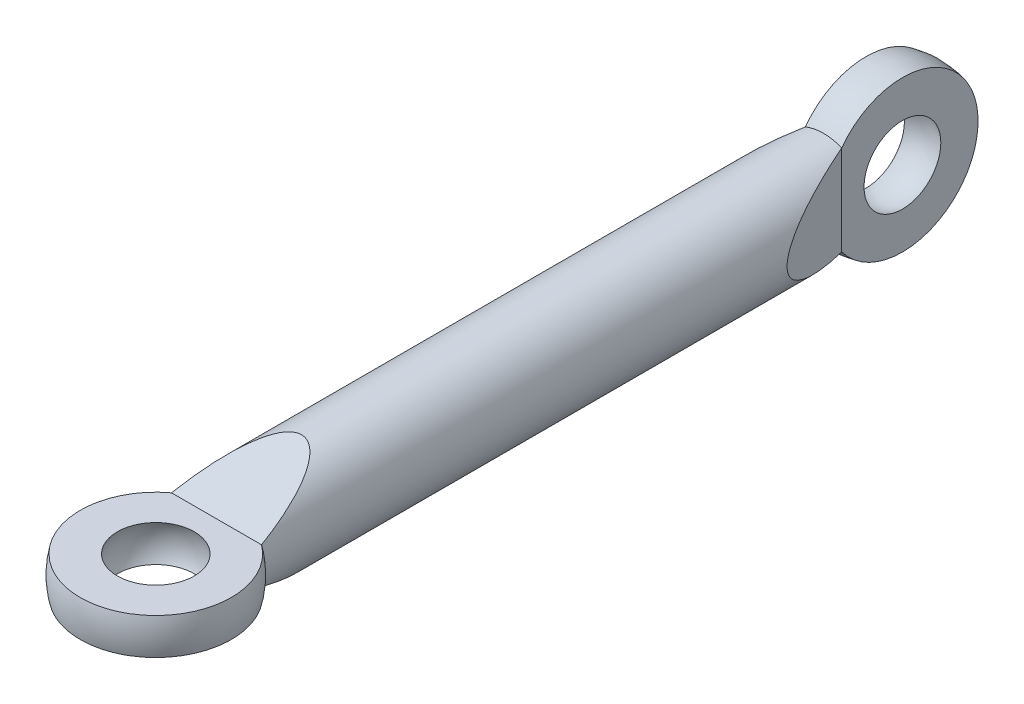
ISO-10303-21;
HEADER;
FILE_DESCRIPTION(('STEP AP214'),'2;1');
FILE_NAME('part.step','',(''),(''),'','','');
FILE_SCHEMA(('AUTOMOTIVE_DESIGN { 1 0 10303 214 1 1 1 1 }'));
ENDSEC;
DATA;
#1=APPLICATION_CONTEXT('core data for automotive mechanical design processes');
#2=APPLICATION_PROTOCOL_DEFINITION('international standard','automotive_design',2000,#1);
#3=PRODUCT_CONTEXT('',#1,'mechanical');
#4=PRODUCT('Part','Part','',(#3));
#5=PRODUCT_RELATED_PRODUCT_CATEGORY('part','',(#4));
#6=PRODUCT_DEFINITION_FORMATION('','',#4);
#7=PRODUCT_DEFINITION_CONTEXT('part definition',#1,'design');
#8=PRODUCT_DEFINITION('design','',#6,#7);
#9=PRODUCT_DEFINITION_SHAPE('','',#8);
#10=(LENGTH_UNIT() NAMED_UNIT(*) SI_UNIT(.MILLI.,.METRE.));
#11=(NAMED_UNIT(*) PLANE_ANGLE_UNIT() SI_UNIT($,.RADIAN.));
#12=(NAMED_UNIT(*) SI_UNIT($,.STERADIAN.) SOLID_ANGLE_UNIT());
#13=UNCERTAINTY_MEASURE_WITH_UNIT(LENGTH_MEASURE(1.E-05),#10,'distance_accuracy_value','');
#14=(GEOMETRIC_REPRESENTATION_CONTEXT(3) GLOBAL_UNCERTAINTY_ASSIGNED_CONTEXT((#13)) GLOBAL_UNIT_ASSIGNED_CONTEXT((#10,
#11,#12)) REPRESENTATION_CONTEXT('',''));
#15=CARTESIAN_POINT('',(0.,0.,0.));
#16=DIRECTION('',(0.,0.,1.));
#17=DIRECTION('',(1.,0.,0.));
#18=AXIS2_PLACEMENT_3D('',#15,#16,#17);
#19=CARTESIAN_POINT('',(0.,0.,25.));
#20=DIRECTION('',(0.,0.,-1.));
#21=DIRECTION('',(-1.,0.,0.));
#22=AXIS2_PLACEMENT_3D('',#19,#20,#21);
#23=CYLINDRICAL_SURFACE('',#22,4.);
#24=CARTESIAN_POINT('',(0.,0.,-25.));
#25=DIRECTION('',(0.,0.,1.));
#26=DIRECTION('',(1.,0.,0.));
#27=AXIS2_PLACEMENT_3D('',#24,#25,#26);
#28=CIRCLE('',#27,4.);
#29=CARTESIAN_POINT('',(-1.5,3.70809924354783,-25.));
#30=VERTEX_POINT('',#29);
#31=CARTESIAN_POINT('',(1.5,3.70809924354784,-25.));
#32=VERTEX_POINT('',#31);
#33=EDGE_CURVE('E85',#30,#32,#28,.F.);
#34=ORIENTED_EDGE('',*,*,#33,.F.);
#35=CARTESIAN_POINT('',(0.,0.,-29.2));
#36=DIRECTION('',(0.941741911594837,0.,0.336336396998156));
#37=DIRECTION('',(0.336336396998156,0.,-0.941741911594837));
#38=AXIS2_PLACEMENT_3D('',#35,#36,#37);
#39=ELLIPSE('',#38,11.8928549978548,4.);
#40=CARTESIAN_POINT('',(-1.5,-3.70809924354783,-25.));
#41=VERTEX_POINT('',#40);
#42=EDGE_CURVE('E80',#30,#41,#39,.T.);
#43=ORIENTED_EDGE('',*,*,#42,.T.);
#44=CARTESIAN_POINT('',(1.5,-3.70809924354783,-25.));
#45=VERTEX_POINT('',#44);
#46=EDGE_CURVE('E84',#45,#41,#28,.F.);
#47=ORIENTED_EDGE('',*,*,#46,.F.);
#48=CARTESIAN_POINT('',(0.,0.,-29.2));
#49=DIRECTION('',(-0.941741911594837,0.,0.336336396998156));
#50=DIRECTION('',(-0.336336396998156,0.,-0.941741911594837));
#51=AXIS2_PLACEMENT_3D('',#48,#49,#50);
#52=ELLIPSE('',#51,11.8928549978548,4.);
#53=EDGE_CURVE('E116',#45,#32,#52,.T.);
#54=ORIENTED_EDGE('',*,*,#53,.T.);
#55=EDGE_LOOP('',(#34,#43,#47,#54));
#56=FACE_BOUND('',#55,.T.);
#57=CARTESIAN_POINT('',(0.,0.,29.2));
#58=DIRECTION('',(0.,0.941741911594838,-0.336336396998155));
#59=DIRECTION('',(0.,-0.336336396998155,-0.941741911594838));
#60=AXIS2_PLACEMENT_3D('',#57,#58,#59);
#61=ELLIPSE('',#60,11.8928549978548,4.);
#62=CARTESIAN_POINT('',(3.70809924354783,-1.50000000000001,25.));
#63=VERTEX_POINT('',#62);
#64=CARTESIAN_POINT('',(-3.70809924354783,-1.50000000000001,25.));
#65=VERTEX_POINT('',#64);
#66=EDGE_CURVE('E125',#63,#65,#61,.T.);
#67=ORIENTED_EDGE('',*,*,#66,.T.);
#68=CARTESIAN_POINT('',(0.,0.,25.));
#69=DIRECTION('',(0.,0.,1.));
#70=DIRECTION('',(1.,0.,0.));
#71=AXIS2_PLACEMENT_3D('',#68,#69,#70);
#72=CIRCLE('',#71,4.);
#73=CARTESIAN_POINT('',(-3.70809924354783,1.5,25.));
#74=VERTEX_POINT('',#73);
#75=EDGE_CURVE('E11',#74,#65,#72,.T.);
#76=ORIENTED_EDGE('',*,*,#75,.F.);
#77=CARTESIAN_POINT('',(0.,0.,29.2));
#78=DIRECTION('',(0.,-0.941741911594838,-0.336336396998156));
#79=DIRECTION('',(0.,0.336336396998156,-0.941741911594838));
#80=AXIS2_PLACEMENT_3D('',#77,#78,#79);
#81=ELLIPSE('',#80,11.8928549978548,4.);
#82=CARTESIAN_POINT('',(3.70809924354783,1.5,25.));
#83=VERTEX_POINT('',#82);
#84=EDGE_CURVE('E99',#74,#83,#81,.T.);
#85=ORIENTED_EDGE('',*,*,#84,.T.);
#86=EDGE_CURVE('E44',#63,#83,#72,.T.);
#87=ORIENTED_EDGE('',*,*,#86,.F.);
#88=EDGE_LOOP('',(#67,#76,#85,#87));
#89=FACE_BOUND('',#88,.T.);
#90=ADVANCED_FACE('F36',(#56,#89),#23,.T.);
#91=CARTESIAN_POINT('',(0.,0.,-30.));
#92=DIRECTION('',(0.,0.,-1.));
#93=DIRECTION('',(1.,0.,0.));
#94=AXIS2_PLACEMENT_3D('',#91,#92,#93);
#95=SPHERICAL_SURFACE('',#94,6.40312423743285);
#96=ORIENTED_EDGE('',*,*,#46,.T.);
#97=CARTESIAN_POINT('',(-1.5,0.,-30.));
#98=DIRECTION('',(1.,0.,0.));
#99=DIRECTION('',(0.,0.,-1.));
#100=AXIS2_PLACEMENT_3D('',#97,#98,#99);
#101=CIRCLE('',#100,6.22494979899437);
#102=EDGE_CURVE('E88',#41,#30,#101,.T.);
#103=ORIENTED_EDGE('',*,*,#102,.T.);
#104=ORIENTED_EDGE('',*,*,#33,.T.);
#105=CARTESIAN_POINT('',(1.5,0.,-30.));
#106=DIRECTION('',(-1.,0.,0.));
#107=DIRECTION('',(0.,0.,1.));
#108=AXIS2_PLACEMENT_3D('',#105,#106,#107);
#109=CIRCLE('',#108,6.22494979899437);
#110=EDGE_CURVE('E97',#32,#45,#109,.T.);
#111=ORIENTED_EDGE('',*,*,#110,.T.);
#112=EDGE_LOOP('',(#96,#103,#104,#111));
#113=FACE_BOUND('',#112,.T.);
#114=ADVANCED_FACE('F96',(#113),#95,.T.);
#115=CARTESIAN_POINT('',(0.,0.,30.));
#116=DIRECTION('',(0.,0.,-1.));
#117=DIRECTION('',(1.,0.,0.));
#118=AXIS2_PLACEMENT_3D('',#115,#116,#117);
#119=SPHERICAL_SURFACE('',#118,6.40312423743285);
#120=CARTESIAN_POINT('',(0.,-1.50000000000001,30.));
#121=DIRECTION('',(0.,1.,0.));
#122=DIRECTION('',(0.,0.,1.));
#123=AXIS2_PLACEMENT_3D('',#120,#121,#122);
#124=CIRCLE('',#123,6.22494979899436);
#125=EDGE_CURVE('E110',#63,#65,#124,.F.);
#126=ORIENTED_EDGE('',*,*,#125,.F.);
#127=ORIENTED_EDGE('',*,*,#86,.T.);
#128=CARTESIAN_POINT('',(0.,1.5,30.));
#129=DIRECTION('',(0.,-1.,0.));
#130=DIRECTION('',(0.,0.,-1.));
#131=AXIS2_PLACEMENT_3D('',#128,#129,#130);
#132=CIRCLE('',#131,6.22494979899436);
#133=EDGE_CURVE('E106',#74,#83,#132,.F.);
#134=ORIENTED_EDGE('',*,*,#133,.F.);
#135=ORIENTED_EDGE('',*,*,#75,.T.);
#136=EDGE_LOOP('',(#126,#127,#134,#135));
#137=FACE_BOUND('',#136,.T.);
#138=ADVANCED_FACE('F139',(#137),#119,.T.);
#139=CARTESIAN_POINT('',(-6.40312423743285,4.,18.));
#140=DIRECTION('',(0.,-0.941741911594838,-0.336336396998156));
#141=DIRECTION('',(0.,0.336336396998156,-0.941741911594838));
#142=AXIS2_PLACEMENT_3D('',#139,#140,#141);
#143=PLANE('',#142);
#144=ORIENTED_EDGE('',*,*,#84,.F.);
#145=DIRECTION('',(1.,0.,0.));
#146=VECTOR('',#145,1.);
#147=CARTESIAN_POINT('',(-6.40312423743285,1.5,25.));
#148=LINE('',#147,#146);
#149=EDGE_CURVE('E107',#74,#83,#148,.T.);
#150=ORIENTED_EDGE('',*,*,#149,.T.);
#151=EDGE_LOOP('',(#144,#150));
#152=FACE_BOUND('',#151,.T.);
#153=ADVANCED_FACE('F136',(#152),#143,.F.);
#154=CARTESIAN_POINT('',(-6.40312423743285,1.5,25.));
#155=DIRECTION('',(0.,-1.,0.));
#156=DIRECTION('',(0.,0.,-1.));
#157=AXIS2_PLACEMENT_3D('',#154,#155,#156);
#158=PLANE('',#157);
#159=ORIENTED_EDGE('',*,*,#133,.T.);
#160=ORIENTED_EDGE('',*,*,#149,.F.);
#161=EDGE_LOOP('',(#159,#160));
#162=FACE_BOUND('',#161,.T.);
#163=CARTESIAN_POINT('',(0.,1.5,30.));
#164=DIRECTION('',(0.,-1.,0.));
#165=DIRECTION('',(0.,0.,-1.));
#166=AXIS2_PLACEMENT_3D('',#163,#164,#165);
#167=CIRCLE('',#166,3.16227766016838);
#168=CARTESIAN_POINT('',(0.,1.5,26.8377223398316));
#169=VERTEX_POINT('',#168);
#170=EDGE_CURVE('E103',#169,#169,#167,.F.);
#171=ORIENTED_EDGE('',*,*,#170,.F.);
#172=EDGE_LOOP('',(#171));
#173=FACE_BOUND('',#172,.T.);
#174=ADVANCED_FACE('F156',(#162,#173),#158,.F.);
#175=CARTESIAN_POINT('',(0.,0.,30.));
#176=DIRECTION('',(0.,0.,-1.));
#177=DIRECTION('',(1.,0.,0.));
#178=AXIS2_PLACEMENT_3D('',#175,#176,#177);
#179=SPHERICAL_SURFACE('',#178,3.5);
#180=CARTESIAN_POINT('',(0.,0.,30.));
#181=DIRECTION('',(0.,1.,0.));
#182=DIRECTION('',(0.,0.,1.));
#183=AXIS2_PLACEMENT_3D('',#180,#181,#182);
#184=SPHERICAL_SURFACE('',#183,3.5);
#185=CARTESIAN_POINT('',(0.,-1.50000000000001,30.));
#186=DIRECTION('',(0.,1.,0.));
#187=DIRECTION('',(0.,0.,1.));
#188=AXIS2_PLACEMENT_3D('',#185,#186,#187);
#189=CIRCLE('',#188,3.16227766016838);
#190=CARTESIAN_POINT('',(0.,-1.50000000000001,33.1622776601684));
#191=VERTEX_POINT('',#190);
#192=EDGE_CURVE('E108',#191,#191,#189,.F.);
#193=ORIENTED_EDGE('',*,*,#192,.T.);
#194=EDGE_LOOP('',(#193));
#195=FACE_BOUND('',#194,.T.);
#196=ORIENTED_EDGE('',*,*,#170,.T.);
#197=EDGE_LOOP('',(#196));
#198=FACE_BOUND('',#197,.T.);
#199=ADVANCED_FACE('F148',(#195,#198),#184,.F.);
#200=CARTESIAN_POINT('',(-6.40312423743285,-4.,18.));
#201=DIRECTION('',(0.,0.941741911594838,-0.336336396998155));
#202=DIRECTION('',(0.,0.336336396998155,0.941741911594838));
#203=AXIS2_PLACEMENT_3D('',#200,#201,#202);
#204=PLANE('',#203);
#205=ORIENTED_EDGE('',*,*,#66,.F.);
#206=DIRECTION('',(1.,0.,0.));
#207=VECTOR('',#206,1.);
#208=CARTESIAN_POINT('',(-6.40312423743285,-1.50000000000001,25.));
#209=LINE('',#208,#207);
#210=EDGE_CURVE('E111',#65,#63,#209,.T.);
#211=ORIENTED_EDGE('',*,*,#210,.F.);
#212=EDGE_LOOP('',(#205,#211));
#213=FACE_BOUND('',#212,.T.);
#214=ADVANCED_FACE('F146',(#213),#204,.F.);
#215=CARTESIAN_POINT('',(-6.40312423743285,-1.50000000000001,25.));
#216=DIRECTION('',(0.,1.,0.));
#217=DIRECTION('',(0.,0.,1.));
#218=AXIS2_PLACEMENT_3D('',#215,#216,#217);
#219=PLANE('',#218);
#220=ORIENTED_EDGE('',*,*,#125,.T.);
#221=ORIENTED_EDGE('',*,*,#210,.T.);
#222=EDGE_LOOP('',(#220,#221));
#223=FACE_BOUND('',#222,.T.);
#224=ORIENTED_EDGE('',*,*,#192,.F.);
#225=EDGE_LOOP('',(#224));
#226=FACE_BOUND('',#225,.T.);
#227=ADVANCED_FACE('F142',(#223,#226),#219,.F.);
#228=CARTESIAN_POINT('',(4.,-6.40312423743285,-18.));
#229=DIRECTION('',(-0.941741911594837,0.,0.336336396998156));
#230=DIRECTION('',(0.336336396998156,0.,0.941741911594837));
#231=AXIS2_PLACEMENT_3D('',#228,#229,#230);
#232=PLANE('',#231);
#233=DIRECTION('',(0.,1.,0.));
#234=VECTOR('',#233,1.);
#235=CARTESIAN_POINT('',(1.5,-6.40312423743285,-25.));
#236=LINE('',#235,#234);
#237=EDGE_CURVE('E58',#45,#32,#236,.T.);
#238=ORIENTED_EDGE('',*,*,#237,.T.);
#239=ORIENTED_EDGE('',*,*,#53,.F.);
#240=EDGE_LOOP('',(#238,#239));
#241=FACE_BOUND('',#240,.T.);
#242=ADVANCED_FACE('F154',(#241),#232,.F.);
#243=CARTESIAN_POINT('',(1.5,-6.40312423743285,-25.));
#244=DIRECTION('',(-1.,0.,0.));
#245=DIRECTION('',(0.,0.,1.));
#246=AXIS2_PLACEMENT_3D('',#243,#244,#245);
#247=PLANE('',#246);
#248=CARTESIAN_POINT('',(1.5,0.,-30.));
#249=DIRECTION('',(-1.,0.,0.));
#250=DIRECTION('',(0.,0.,1.));
#251=AXIS2_PLACEMENT_3D('',#248,#249,#250);
#252=CIRCLE('',#251,3.16227766016838);
#253=CARTESIAN_POINT('',(1.5,0.,-26.8377223398316));
#254=VERTEX_POINT('',#253);
#255=EDGE_CURVE('E112',#254,#254,#252,.T.);
#256=ORIENTED_EDGE('',*,*,#255,.T.);
#257=EDGE_LOOP('',(#256));
#258=FACE_BOUND('',#257,.T.);
#259=ORIENTED_EDGE('',*,*,#237,.F.);
#260=ORIENTED_EDGE('',*,*,#110,.F.);
#261=EDGE_LOOP('',(#259,#260));
#262=FACE_BOUND('',#261,.T.);
#263=ADVANCED_FACE('F171',(#258,#262),#247,.F.);
#264=CARTESIAN_POINT('',(0.,0.,-30.));
#265=DIRECTION('',(0.,0.,-1.));
#266=DIRECTION('',(1.,0.,0.));
#267=AXIS2_PLACEMENT_3D('',#264,#265,#266);
#268=SPHERICAL_SURFACE('',#267,3.5);
#269=CARTESIAN_POINT('',(0.,0.,-30.));
#270=DIRECTION('',(1.,0.,0.));
#271=DIRECTION('',(0.,0.,-1.));
#272=AXIS2_PLACEMENT_3D('',#269,#270,#271);
#273=SPHERICAL_SURFACE('',#272,3.5);
#274=CARTESIAN_POINT('',(-1.5,0.,-30.));
#275=DIRECTION('',(1.,0.,0.));
#276=DIRECTION('',(0.,0.,-1.));
#277=AXIS2_PLACEMENT_3D('',#274,#275,#276);
#278=CIRCLE('',#277,3.16227766016838);
#279=CARTESIAN_POINT('',(-1.5,0.,-33.1622776601684));
#280=VERTEX_POINT('',#279);
#281=EDGE_CURVE('E39',#280,#280,#278,.T.);
#282=ORIENTED_EDGE('',*,*,#281,.F.);
#283=EDGE_LOOP('',(#282));
#284=FACE_BOUND('',#283,.T.);
#285=ORIENTED_EDGE('',*,*,#255,.F.);
#286=EDGE_LOOP('',(#285));
#287=FACE_BOUND('',#286,.T.);
#288=ADVANCED_FACE('F169',(#284,#287),#273,.F.);
#289=CARTESIAN_POINT('',(-4.,-6.40312423743285,-18.));
#290=DIRECTION('',(0.941741911594837,0.,0.336336396998156));
#291=DIRECTION('',(0.336336396998156,0.,-0.941741911594837));
#292=AXIS2_PLACEMENT_3D('',#289,#290,#291);
#293=PLANE('',#292);
#294=DIRECTION('',(0.,1.,0.));
#295=VECTOR('',#294,1.);
#296=CARTESIAN_POINT('',(-1.5,-6.40312423743285,-25.));
#297=LINE('',#296,#295);
#298=EDGE_CURVE('E51',#41,#30,#297,.T.);
#299=ORIENTED_EDGE('',*,*,#298,.F.);
#300=ORIENTED_EDGE('',*,*,#42,.F.);
#301=EDGE_LOOP('',(#299,#300));
#302=FACE_BOUND('',#301,.T.);
#303=ADVANCED_FACE('F93',(#302),#293,.F.);
#304=CARTESIAN_POINT('',(-1.5,-6.40312423743285,-25.));
#305=DIRECTION('',(1.,0.,0.));
#306=DIRECTION('',(0.,0.,-1.));
#307=AXIS2_PLACEMENT_3D('',#304,#305,#306);
#308=PLANE('',#307);
#309=ORIENTED_EDGE('',*,*,#281,.T.);
#310=EDGE_LOOP('',(#309));
#311=FACE_BOUND('',#310,.T.);
#312=ORIENTED_EDGE('',*,*,#298,.T.);
#313=ORIENTED_EDGE('',*,*,#102,.F.);
#314=EDGE_LOOP('',(#312,#313));
#315=FACE_BOUND('',#314,.T.);
#316=ADVANCED_FACE('F90',(#311,#315),#308,.F.);
#317=CLOSED_SHELL('',(#90,#114,#138,#153,#174,#199,#214,#227,#242,#263,#288,#303,#316));
#318=MANIFOLD_SOLID_BREP('B2',#317);
#319=ADVANCED_BREP_SHAPE_REPRESENTATION('',(#18,#318),#14);
#320=SHAPE_DEFINITION_REPRESENTATION(#9,#319);
ENDSEC;
END-ISO-10303-21;
